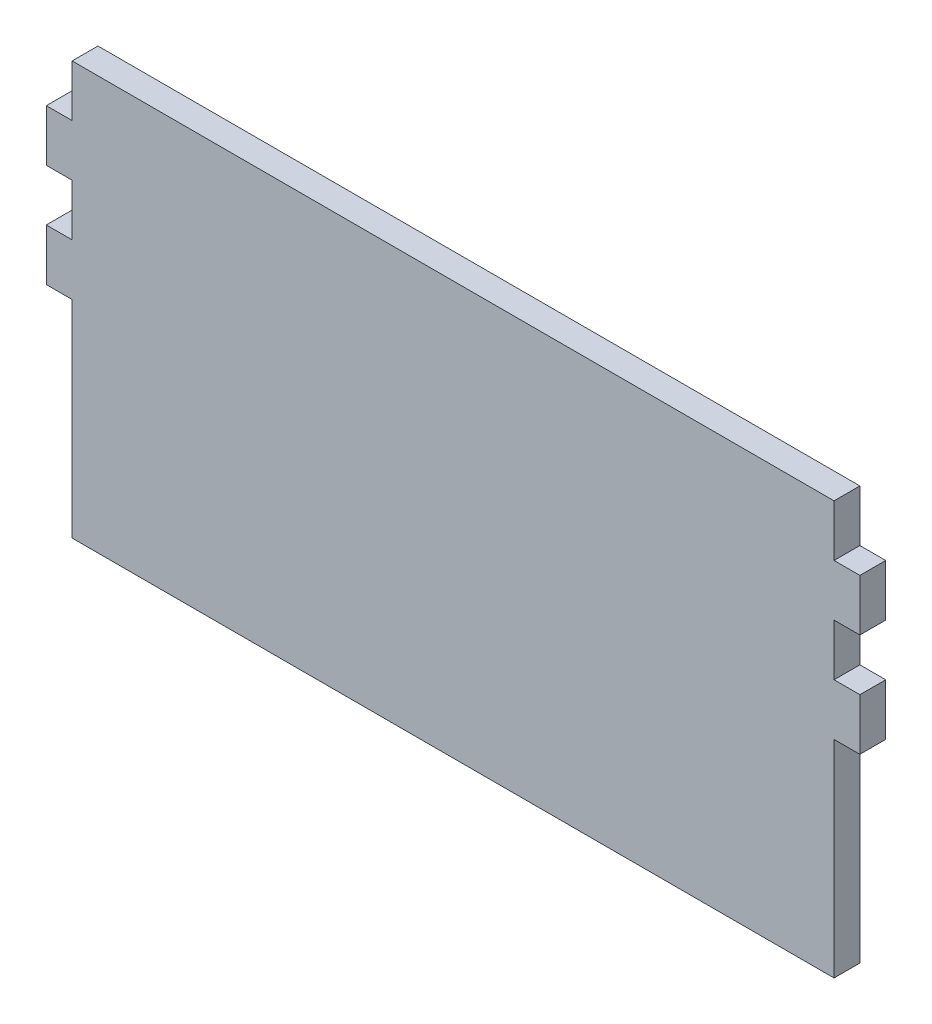
ISO-10303-21;
HEADER;
FILE_DESCRIPTION(('STEP AP214'),'2;1');
FILE_NAME('part.step','',(''),(''),'','','');
FILE_SCHEMA(('AUTOMOTIVE_DESIGN { 1 0 10303 214 1 1 1 1 }'));
ENDSEC;
DATA;
#1=APPLICATION_CONTEXT('core data for automotive mechanical design processes');
#2=APPLICATION_PROTOCOL_DEFINITION('international standard','automotive_design',2000,#1);
#3=PRODUCT_CONTEXT('',#1,'mechanical');
#4=PRODUCT('Part','Part','',(#3));
#5=PRODUCT_RELATED_PRODUCT_CATEGORY('part','',(#4));
#6=PRODUCT_DEFINITION_FORMATION('','',#4);
#7=PRODUCT_DEFINITION_CONTEXT('part definition',#1,'design');
#8=PRODUCT_DEFINITION('design','',#6,#7);
#9=PRODUCT_DEFINITION_SHAPE('','',#8);
#10=(LENGTH_UNIT() NAMED_UNIT(*) SI_UNIT(.MILLI.,.METRE.));
#11=(NAMED_UNIT(*) PLANE_ANGLE_UNIT() SI_UNIT($,.RADIAN.));
#12=(NAMED_UNIT(*) SI_UNIT($,.STERADIAN.) SOLID_ANGLE_UNIT());
#13=UNCERTAINTY_MEASURE_WITH_UNIT(LENGTH_MEASURE(1.E-05),#10,'distance_accuracy_value','');
#14=(GEOMETRIC_REPRESENTATION_CONTEXT(3) GLOBAL_UNCERTAINTY_ASSIGNED_CONTEXT((#13)) GLOBAL_UNIT_ASSIGNED_CONTEXT((#10,
#11,#12)) REPRESENTATION_CONTEXT('',''));
#15=CARTESIAN_POINT('',(0.,0.,0.));
#16=DIRECTION('',(0.,0.,1.));
#17=DIRECTION('',(1.,0.,0.));
#18=AXIS2_PLACEMENT_3D('',#15,#16,#17);
#19=CARTESIAN_POINT('',(93.6625,50.8,3.175));
#20=DIRECTION('',(-1.,0.,0.));
#21=DIRECTION('',(0.,0.,1.));
#22=AXIS2_PLACEMENT_3D('',#19,#20,#21);
#23=PLANE('',#22);
#24=DIRECTION('',(0.,1.,0.));
#25=VECTOR('',#24,1.);
#26=CARTESIAN_POINT('',(93.6625,50.8,-3.175));
#27=LINE('',#26,#25);
#28=CARTESIAN_POINT('',(93.6625,38.1,-3.175));
#29=VERTEX_POINT('',#28);
#30=CARTESIAN_POINT('',(93.6625,50.8,-3.175));
#31=VERTEX_POINT('',#30);
#32=EDGE_CURVE('E201',#29,#31,#27,.T.);
#33=ORIENTED_EDGE('',*,*,#32,.T.);
#34=DIRECTION('',(0.,0.,-1.));
#35=VECTOR('',#34,1.);
#36=CARTESIAN_POINT('',(93.6625,50.8,3.175));
#37=LINE('',#36,#35);
#38=CARTESIAN_POINT('',(93.6625,50.8,3.175));
#39=VERTEX_POINT('',#38);
#40=EDGE_CURVE('E11',#39,#31,#37,.T.);
#41=ORIENTED_EDGE('',*,*,#40,.F.);
#42=DIRECTION('',(0.,1.,0.));
#43=VECTOR('',#42,1.);
#44=CARTESIAN_POINT('',(93.6625,50.8,3.175));
#45=LINE('',#44,#43);
#46=CARTESIAN_POINT('',(93.6625,38.1,3.175));
#47=VERTEX_POINT('',#46);
#48=EDGE_CURVE('E239',#47,#39,#45,.T.);
#49=ORIENTED_EDGE('',*,*,#48,.F.);
#50=DIRECTION('',(0.,0.,-1.));
#51=VECTOR('',#50,1.);
#52=CARTESIAN_POINT('',(93.6625,38.1,3.175));
#53=LINE('',#52,#51);
#54=EDGE_CURVE('E197',#47,#29,#53,.T.);
#55=ORIENTED_EDGE('',*,*,#54,.T.);
#56=EDGE_LOOP('',(#33,#41,#49,#55));
#57=FACE_BOUND('',#56,.T.);
#58=ADVANCED_FACE('F33',(#57),#23,.F.);
#59=CARTESIAN_POINT('',(-93.6625,50.8,3.175));
#60=DIRECTION('',(0.,-1.,0.));
#61=DIRECTION('',(0.,0.,-1.));
#62=AXIS2_PLACEMENT_3D('',#59,#60,#61);
#63=PLANE('',#62);
#64=DIRECTION('',(-1.,0.,0.));
#65=VECTOR('',#64,1.);
#66=CARTESIAN_POINT('',(-93.6625,50.8,-3.175));
#67=LINE('',#66,#65);
#68=CARTESIAN_POINT('',(-93.6625,50.8,-3.175));
#69=VERTEX_POINT('',#68);
#70=EDGE_CURVE('E204',#31,#69,#67,.T.);
#71=ORIENTED_EDGE('',*,*,#70,.T.);
#72=DIRECTION('',(0.,0.,-1.));
#73=VECTOR('',#72,1.);
#74=CARTESIAN_POINT('',(-93.6625,50.8,3.175));
#75=LINE('',#74,#73);
#76=CARTESIAN_POINT('',(-93.6625,50.8,3.175));
#77=VERTEX_POINT('',#76);
#78=EDGE_CURVE('E41',#77,#69,#75,.T.);
#79=ORIENTED_EDGE('',*,*,#78,.F.);
#80=DIRECTION('',(-1.,0.,0.));
#81=VECTOR('',#80,1.);
#82=CARTESIAN_POINT('',(-93.6625,50.8,3.175));
#83=LINE('',#82,#81);
#84=EDGE_CURVE('E128',#39,#77,#83,.T.);
#85=ORIENTED_EDGE('',*,*,#84,.F.);
#86=ORIENTED_EDGE('',*,*,#40,.T.);
#87=EDGE_LOOP('',(#71,#79,#85,#86));
#88=FACE_BOUND('',#87,.T.);
#89=ADVANCED_FACE('F357',(#88),#63,.F.);
#90=CARTESIAN_POINT('',(-93.6625,50.8,3.175));
#91=DIRECTION('',(1.,0.,0.));
#92=DIRECTION('',(0.,0.,-1.));
#93=AXIS2_PLACEMENT_3D('',#90,#91,#92);
#94=PLANE('',#93);
#95=DIRECTION('',(0.,-1.,0.));
#96=VECTOR('',#95,1.);
#97=CARTESIAN_POINT('',(-93.6625,50.8,-3.175));
#98=LINE('',#97,#96);
#99=CARTESIAN_POINT('',(-93.6625,38.1,-3.175));
#100=VERTEX_POINT('',#99);
#101=EDGE_CURVE('E206',#69,#100,#98,.T.);
#102=ORIENTED_EDGE('',*,*,#101,.T.);
#103=DIRECTION('',(0.,0.,-1.));
#104=VECTOR('',#103,1.);
#105=CARTESIAN_POINT('',(-93.6625,38.1,3.175));
#106=LINE('',#105,#104);
#107=CARTESIAN_POINT('',(-93.6625,38.1,3.175));
#108=VERTEX_POINT('',#107);
#109=EDGE_CURVE('E282',#108,#100,#106,.T.);
#110=ORIENTED_EDGE('',*,*,#109,.F.);
#111=DIRECTION('',(0.,-1.,0.));
#112=VECTOR('',#111,1.);
#113=CARTESIAN_POINT('',(-93.6625,50.8,3.175));
#114=LINE('',#113,#112);
#115=EDGE_CURVE('E290',#77,#108,#114,.T.);
#116=ORIENTED_EDGE('',*,*,#115,.F.);
#117=ORIENTED_EDGE('',*,*,#78,.T.);
#118=EDGE_LOOP('',(#102,#110,#116,#117));
#119=FACE_BOUND('',#118,.T.);
#120=ADVANCED_FACE('F288',(#119),#94,.F.);
#121=CARTESIAN_POINT('',(-93.6625,38.1,3.175));
#122=DIRECTION('',(0.,-1.,0.));
#123=DIRECTION('',(0.,0.,-1.));
#124=AXIS2_PLACEMENT_3D('',#121,#122,#123);
#125=PLANE('',#124);
#126=DIRECTION('',(-1.,0.,0.));
#127=VECTOR('',#126,1.);
#128=CARTESIAN_POINT('',(-93.6625,38.1,-3.175));
#129=LINE('',#128,#127);
#130=CARTESIAN_POINT('',(-100.0125,38.1,-3.175));
#131=VERTEX_POINT('',#130);
#132=EDGE_CURVE('E208',#100,#131,#129,.T.);
#133=ORIENTED_EDGE('',*,*,#132,.T.);
#134=DIRECTION('',(0.,0.,-1.));
#135=VECTOR('',#134,1.);
#136=CARTESIAN_POINT('',(-100.0125,38.1,3.175));
#137=LINE('',#136,#135);
#138=CARTESIAN_POINT('',(-100.0125,38.1,3.175));
#139=VERTEX_POINT('',#138);
#140=EDGE_CURVE('E279',#139,#131,#137,.T.);
#141=ORIENTED_EDGE('',*,*,#140,.F.);
#142=DIRECTION('',(-1.,0.,0.));
#143=VECTOR('',#142,1.);
#144=CARTESIAN_POINT('',(-93.6625,38.1,3.175));
#145=LINE('',#144,#143);
#146=EDGE_CURVE('E308',#108,#139,#145,.T.);
#147=ORIENTED_EDGE('',*,*,#146,.F.);
#148=ORIENTED_EDGE('',*,*,#109,.T.);
#149=EDGE_LOOP('',(#133,#141,#147,#148));
#150=FACE_BOUND('',#149,.T.);
#151=ADVANCED_FACE('F299',(#150),#125,.F.);
#152=CARTESIAN_POINT('',(-100.0125,38.1,3.175));
#153=DIRECTION('',(1.,0.,0.));
#154=DIRECTION('',(0.,0.,-1.));
#155=AXIS2_PLACEMENT_3D('',#152,#153,#154);
#156=PLANE('',#155);
#157=DIRECTION('',(0.,-1.,0.));
#158=VECTOR('',#157,1.);
#159=CARTESIAN_POINT('',(-100.0125,38.1,-3.175));
#160=LINE('',#159,#158);
#161=CARTESIAN_POINT('',(-100.0125,25.4,-3.175));
#162=VERTEX_POINT('',#161);
#163=EDGE_CURVE('E210',#131,#162,#160,.T.);
#164=ORIENTED_EDGE('',*,*,#163,.T.);
#165=DIRECTION('',(0.,0.,-1.));
#166=VECTOR('',#165,1.);
#167=CARTESIAN_POINT('',(-100.0125,25.4,3.175));
#168=LINE('',#167,#166);
#169=CARTESIAN_POINT('',(-100.0125,25.4,3.175));
#170=VERTEX_POINT('',#169);
#171=EDGE_CURVE('E276',#170,#162,#168,.T.);
#172=ORIENTED_EDGE('',*,*,#171,.F.);
#173=DIRECTION('',(0.,-1.,0.));
#174=VECTOR('',#173,1.);
#175=CARTESIAN_POINT('',(-100.0125,38.1,3.175));
#176=LINE('',#175,#174);
#177=EDGE_CURVE('E305',#139,#170,#176,.T.);
#178=ORIENTED_EDGE('',*,*,#177,.F.);
#179=ORIENTED_EDGE('',*,*,#140,.T.);
#180=EDGE_LOOP('',(#164,#172,#178,#179));
#181=FACE_BOUND('',#180,.T.);
#182=ADVANCED_FACE('F303',(#181),#156,.F.);
#183=CARTESIAN_POINT('',(-100.0125,25.4,3.175));
#184=DIRECTION('',(0.,1.,0.));
#185=DIRECTION('',(0.,0.,1.));
#186=AXIS2_PLACEMENT_3D('',#183,#184,#185);
#187=PLANE('',#186);
#188=DIRECTION('',(1.,0.,0.));
#189=VECTOR('',#188,1.);
#190=CARTESIAN_POINT('',(-100.0125,25.4,-3.175));
#191=LINE('',#190,#189);
#192=CARTESIAN_POINT('',(-93.6625,25.4,-3.175));
#193=VERTEX_POINT('',#192);
#194=EDGE_CURVE('E212',#162,#193,#191,.T.);
#195=ORIENTED_EDGE('',*,*,#194,.T.);
#196=DIRECTION('',(0.,0.,-1.));
#197=VECTOR('',#196,1.);
#198=CARTESIAN_POINT('',(-93.6625,25.4,3.175));
#199=LINE('',#198,#197);
#200=CARTESIAN_POINT('',(-93.6625,25.4,3.175));
#201=VERTEX_POINT('',#200);
#202=EDGE_CURVE('E273',#201,#193,#199,.T.);
#203=ORIENTED_EDGE('',*,*,#202,.F.);
#204=DIRECTION('',(1.,0.,0.));
#205=VECTOR('',#204,1.);
#206=CARTESIAN_POINT('',(-100.0125,25.4,3.175));
#207=LINE('',#206,#205);
#208=EDGE_CURVE('E307',#170,#201,#207,.T.);
#209=ORIENTED_EDGE('',*,*,#208,.F.);
#210=ORIENTED_EDGE('',*,*,#171,.T.);
#211=EDGE_LOOP('',(#195,#203,#209,#210));
#212=FACE_BOUND('',#211,.T.);
#213=ADVANCED_FACE('F370',(#212),#187,.F.);
#214=CARTESIAN_POINT('',(-93.6625,25.4,3.175));
#215=DIRECTION('',(1.,0.,0.));
#216=DIRECTION('',(0.,0.,-1.));
#217=AXIS2_PLACEMENT_3D('',#214,#215,#216);
#218=PLANE('',#217);
#219=DIRECTION('',(0.,-1.,0.));
#220=VECTOR('',#219,1.);
#221=CARTESIAN_POINT('',(-93.6625,25.4,-3.175));
#222=LINE('',#221,#220);
#223=CARTESIAN_POINT('',(-93.6625,12.7000000000001,-3.175));
#224=VERTEX_POINT('',#223);
#225=EDGE_CURVE('E214',#193,#224,#222,.T.);
#226=ORIENTED_EDGE('',*,*,#225,.T.);
#227=DIRECTION('',(0.,0.,-1.));
#228=VECTOR('',#227,1.);
#229=CARTESIAN_POINT('',(-93.6625,12.7000000000001,3.175));
#230=LINE('',#229,#228);
#231=CARTESIAN_POINT('',(-93.6625,12.7000000000001,3.175));
#232=VERTEX_POINT('',#231);
#233=EDGE_CURVE('E270',#232,#224,#230,.T.);
#234=ORIENTED_EDGE('',*,*,#233,.F.);
#235=DIRECTION('',(0.,-1.,0.));
#236=VECTOR('',#235,1.);
#237=CARTESIAN_POINT('',(-93.6625,25.4,3.175));
#238=LINE('',#237,#236);
#239=EDGE_CURVE('E310',#201,#232,#238,.T.);
#240=ORIENTED_EDGE('',*,*,#239,.F.);
#241=ORIENTED_EDGE('',*,*,#202,.T.);
#242=EDGE_LOOP('',(#226,#234,#240,#241));
#243=FACE_BOUND('',#242,.T.);
#244=ADVANCED_FACE('F373',(#243),#218,.F.);
#245=CARTESIAN_POINT('',(-93.6625,12.7000000000001,3.175));
#246=DIRECTION('',(0.,-1.,0.));
#247=DIRECTION('',(1.,0.,0.));
#248=AXIS2_PLACEMENT_3D('',#245,#246,#247);
#249=PLANE('',#248);
#250=DIRECTION('',(-1.,0.,0.));
#251=VECTOR('',#250,1.);
#252=CARTESIAN_POINT('',(-93.6625,12.7000000000001,-3.175));
#253=LINE('',#252,#251);
#254=CARTESIAN_POINT('',(-100.0125,12.7000000000001,-3.175));
#255=VERTEX_POINT('',#254);
#256=EDGE_CURVE('E216',#224,#255,#253,.T.);
#257=ORIENTED_EDGE('',*,*,#256,.T.);
#258=DIRECTION('',(0.,0.,-1.));
#259=VECTOR('',#258,1.);
#260=CARTESIAN_POINT('',(-100.0125,12.7000000000001,3.175));
#261=LINE('',#260,#259);
#262=CARTESIAN_POINT('',(-100.0125,12.7000000000001,3.175));
#263=VERTEX_POINT('',#262);
#264=EDGE_CURVE('E267',#263,#255,#261,.T.);
#265=ORIENTED_EDGE('',*,*,#264,.F.);
#266=DIRECTION('',(-1.,0.,0.));
#267=VECTOR('',#266,1.);
#268=CARTESIAN_POINT('',(-93.6625,12.7000000000001,3.175));
#269=LINE('',#268,#267);
#270=EDGE_CURVE('E316',#232,#263,#269,.T.);
#271=ORIENTED_EDGE('',*,*,#270,.F.);
#272=ORIENTED_EDGE('',*,*,#233,.T.);
#273=EDGE_LOOP('',(#257,#265,#271,#272));
#274=FACE_BOUND('',#273,.T.);
#275=ADVANCED_FACE('F377',(#274),#249,.F.);
#276=CARTESIAN_POINT('',(-100.0125,12.7000000000001,3.175));
#277=DIRECTION('',(1.,0.,0.));
#278=DIRECTION('',(0.,0.,-1.));
#279=AXIS2_PLACEMENT_3D('',#276,#277,#278);
#280=PLANE('',#279);
#281=DIRECTION('',(0.,-1.,0.));
#282=VECTOR('',#281,1.);
#283=CARTESIAN_POINT('',(-100.0125,12.7000000000001,-3.175));
#284=LINE('',#283,#282);
#285=CARTESIAN_POINT('',(-100.0125,0.,-3.175));
#286=VERTEX_POINT('',#285);
#287=EDGE_CURVE('E218',#255,#286,#284,.T.);
#288=ORIENTED_EDGE('',*,*,#287,.T.);
#289=DIRECTION('',(0.,0.,-1.));
#290=VECTOR('',#289,1.);
#291=CARTESIAN_POINT('',(-100.0125,0.,3.175));
#292=LINE('',#291,#290);
#293=CARTESIAN_POINT('',(-100.0125,0.,3.175));
#294=VERTEX_POINT('',#293);
#295=EDGE_CURVE('E264',#294,#286,#292,.T.);
#296=ORIENTED_EDGE('',*,*,#295,.F.);
#297=DIRECTION('',(0.,-1.,0.));
#298=VECTOR('',#297,1.);
#299=CARTESIAN_POINT('',(-100.0125,12.7000000000001,3.175));
#300=LINE('',#299,#298);
#301=EDGE_CURVE('E318',#263,#294,#300,.T.);
#302=ORIENTED_EDGE('',*,*,#301,.F.);
#303=ORIENTED_EDGE('',*,*,#264,.T.);
#304=EDGE_LOOP('',(#288,#296,#302,#303));
#305=FACE_BOUND('',#304,.T.);
#306=ADVANCED_FACE('F381',(#305),#280,.F.);
#307=CARTESIAN_POINT('',(-100.0125,0.,3.175));
#308=DIRECTION('',(0.,1.,0.));
#309=DIRECTION('',(-1.,0.,0.));
#310=AXIS2_PLACEMENT_3D('',#307,#308,#309);
#311=PLANE('',#310);
#312=DIRECTION('',(1.,0.,0.));
#313=VECTOR('',#312,1.);
#314=CARTESIAN_POINT('',(-100.0125,0.,-3.175));
#315=LINE('',#314,#313);
#316=CARTESIAN_POINT('',(-93.6625,0.,-3.175));
#317=VERTEX_POINT('',#316);
#318=EDGE_CURVE('E220',#286,#317,#315,.T.);
#319=ORIENTED_EDGE('',*,*,#318,.T.);
#320=DIRECTION('',(0.,0.,-1.));
#321=VECTOR('',#320,1.);
#322=CARTESIAN_POINT('',(-93.6625,0.,3.175));
#323=LINE('',#322,#321);
#324=CARTESIAN_POINT('',(-93.6625,0.,3.175));
#325=VERTEX_POINT('',#324);
#326=EDGE_CURVE('E261',#325,#317,#323,.T.);
#327=ORIENTED_EDGE('',*,*,#326,.F.);
#328=DIRECTION('',(1.,0.,0.));
#329=VECTOR('',#328,1.);
#330=CARTESIAN_POINT('',(-100.0125,0.,3.175));
#331=LINE('',#330,#329);
#332=EDGE_CURVE('E320',#294,#325,#331,.T.);
#333=ORIENTED_EDGE('',*,*,#332,.F.);
#334=ORIENTED_EDGE('',*,*,#295,.T.);
#335=EDGE_LOOP('',(#319,#327,#333,#334));
#336=FACE_BOUND('',#335,.T.);
#337=ADVANCED_FACE('F385',(#336),#311,.F.);
#338=CARTESIAN_POINT('',(-93.6625,0.,3.175));
#339=DIRECTION('',(1.,0.,0.));
#340=DIRECTION('',(0.,0.,-1.));
#341=AXIS2_PLACEMENT_3D('',#338,#339,#340);
#342=PLANE('',#341);
#343=DIRECTION('',(0.,-1.,0.));
#344=VECTOR('',#343,1.);
#345=CARTESIAN_POINT('',(-93.6625,0.,-3.175));
#346=LINE('',#345,#344);
#347=CARTESIAN_POINT('',(-93.6625,-50.8,-3.175));
#348=VERTEX_POINT('',#347);
#349=EDGE_CURVE('E222',#317,#348,#346,.T.);
#350=ORIENTED_EDGE('',*,*,#349,.T.);
#351=DIRECTION('',(0.,0.,-1.));
#352=VECTOR('',#351,1.);
#353=CARTESIAN_POINT('',(-93.6625,-50.8,3.175));
#354=LINE('',#353,#352);
#355=CARTESIAN_POINT('',(-93.6625,-50.8,3.175));
#356=VERTEX_POINT('',#355);
#357=EDGE_CURVE('E258',#356,#348,#354,.T.);
#358=ORIENTED_EDGE('',*,*,#357,.F.);
#359=DIRECTION('',(0.,-1.,0.));
#360=VECTOR('',#359,1.);
#361=CARTESIAN_POINT('',(-93.6625,0.,3.175));
#362=LINE('',#361,#360);
#363=EDGE_CURVE('E322',#325,#356,#362,.T.);
#364=ORIENTED_EDGE('',*,*,#363,.F.);
#365=ORIENTED_EDGE('',*,*,#326,.T.);
#366=EDGE_LOOP('',(#350,#358,#364,#365));
#367=FACE_BOUND('',#366,.T.);
#368=ADVANCED_FACE('F389',(#367),#342,.F.);
#369=CARTESIAN_POINT('',(-93.6625,-50.8,3.175));
#370=DIRECTION('',(0.,1.,0.));
#371=DIRECTION('',(0.,0.,1.));
#372=AXIS2_PLACEMENT_3D('',#369,#370,#371);
#373=PLANE('',#372);
#374=DIRECTION('',(1.,0.,0.));
#375=VECTOR('',#374,1.);
#376=CARTESIAN_POINT('',(-93.6625,-50.8,-3.175));
#377=LINE('',#376,#375);
#378=CARTESIAN_POINT('',(93.6625,-50.8,-3.175));
#379=VERTEX_POINT('',#378);
#380=EDGE_CURVE('E224',#348,#379,#377,.T.);
#381=ORIENTED_EDGE('',*,*,#380,.T.);
#382=DIRECTION('',(0.,0.,-1.));
#383=VECTOR('',#382,1.);
#384=CARTESIAN_POINT('',(93.6625,-50.8,3.175));
#385=LINE('',#384,#383);
#386=CARTESIAN_POINT('',(93.6625,-50.8,3.175));
#387=VERTEX_POINT('',#386);
#388=EDGE_CURVE('E255',#387,#379,#385,.T.);
#389=ORIENTED_EDGE('',*,*,#388,.F.);
#390=DIRECTION('',(1.,0.,0.));
#391=VECTOR('',#390,1.);
#392=CARTESIAN_POINT('',(-93.6625,-50.8,3.175));
#393=LINE('',#392,#391);
#394=EDGE_CURVE('E324',#356,#387,#393,.T.);
#395=ORIENTED_EDGE('',*,*,#394,.F.);
#396=ORIENTED_EDGE('',*,*,#357,.T.);
#397=EDGE_LOOP('',(#381,#389,#395,#396));
#398=FACE_BOUND('',#397,.T.);
#399=ADVANCED_FACE('F393',(#398),#373,.F.);
#400=CARTESIAN_POINT('',(93.6625,0.,3.175));
#401=DIRECTION('',(-1.,0.,0.));
#402=DIRECTION('',(0.,0.,1.));
#403=AXIS2_PLACEMENT_3D('',#400,#401,#402);
#404=PLANE('',#403);
#405=DIRECTION('',(0.,1.,0.));
#406=VECTOR('',#405,1.);
#407=CARTESIAN_POINT('',(93.6625,0.,-3.175));
#408=LINE('',#407,#406);
#409=CARTESIAN_POINT('',(93.6625,0.,-3.175));
#410=VERTEX_POINT('',#409);
#411=EDGE_CURVE('E226',#379,#410,#408,.T.);
#412=ORIENTED_EDGE('',*,*,#411,.T.);
#413=DIRECTION('',(0.,0.,-1.));
#414=VECTOR('',#413,1.);
#415=CARTESIAN_POINT('',(93.6625,0.,3.175));
#416=LINE('',#415,#414);
#417=CARTESIAN_POINT('',(93.6625,0.,3.175));
#418=VERTEX_POINT('',#417);
#419=EDGE_CURVE('E252',#418,#410,#416,.T.);
#420=ORIENTED_EDGE('',*,*,#419,.F.);
#421=DIRECTION('',(0.,1.,0.));
#422=VECTOR('',#421,1.);
#423=CARTESIAN_POINT('',(93.6625,0.,3.175));
#424=LINE('',#423,#422);
#425=EDGE_CURVE('E326',#387,#418,#424,.T.);
#426=ORIENTED_EDGE('',*,*,#425,.F.);
#427=ORIENTED_EDGE('',*,*,#388,.T.);
#428=EDGE_LOOP('',(#412,#420,#426,#427));
#429=FACE_BOUND('',#428,.T.);
#430=ADVANCED_FACE('F397',(#429),#404,.F.);
#431=CARTESIAN_POINT('',(100.0125,0.,3.175));
#432=DIRECTION('',(0.,1.,0.));
#433=DIRECTION('',(-1.,0.,0.));
#434=AXIS2_PLACEMENT_3D('',#431,#432,#433);
#435=PLANE('',#434);
#436=DIRECTION('',(1.,0.,0.));
#437=VECTOR('',#436,1.);
#438=CARTESIAN_POINT('',(100.0125,0.,-3.175));
#439=LINE('',#438,#437);
#440=CARTESIAN_POINT('',(100.0125,0.,-3.175));
#441=VERTEX_POINT('',#440);
#442=EDGE_CURVE('E228',#410,#441,#439,.T.);
#443=ORIENTED_EDGE('',*,*,#442,.T.);
#444=DIRECTION('',(0.,0.,-1.));
#445=VECTOR('',#444,1.);
#446=CARTESIAN_POINT('',(100.0125,0.,3.175));
#447=LINE('',#446,#445);
#448=CARTESIAN_POINT('',(100.0125,0.,3.175));
#449=VERTEX_POINT('',#448);
#450=EDGE_CURVE('E249',#449,#441,#447,.T.);
#451=ORIENTED_EDGE('',*,*,#450,.F.);
#452=DIRECTION('',(1.,0.,0.));
#453=VECTOR('',#452,1.);
#454=CARTESIAN_POINT('',(100.0125,0.,3.175));
#455=LINE('',#454,#453);
#456=EDGE_CURVE('E328',#418,#449,#455,.T.);
#457=ORIENTED_EDGE('',*,*,#456,.F.);
#458=ORIENTED_EDGE('',*,*,#419,.T.);
#459=EDGE_LOOP('',(#443,#451,#457,#458));
#460=FACE_BOUND('',#459,.T.);
#461=ADVANCED_FACE('F401',(#460),#435,.F.);
#462=CARTESIAN_POINT('',(100.0125,12.7000000000001,3.175));
#463=DIRECTION('',(-1.,0.,0.));
#464=DIRECTION('',(0.,0.,1.));
#465=AXIS2_PLACEMENT_3D('',#462,#463,#464);
#466=PLANE('',#465);
#467=DIRECTION('',(0.,1.,0.));
#468=VECTOR('',#467,1.);
#469=CARTESIAN_POINT('',(100.0125,12.7000000000001,-3.175));
#470=LINE('',#469,#468);
#471=CARTESIAN_POINT('',(100.0125,12.7000000000001,-3.175));
#472=VERTEX_POINT('',#471);
#473=EDGE_CURVE('E230',#441,#472,#470,.T.);
#474=ORIENTED_EDGE('',*,*,#473,.T.);
#475=DIRECTION('',(0.,0.,-1.));
#476=VECTOR('',#475,1.);
#477=CARTESIAN_POINT('',(100.0125,12.7000000000001,3.175));
#478=LINE('',#477,#476);
#479=CARTESIAN_POINT('',(100.0125,12.7000000000001,3.175));
#480=VERTEX_POINT('',#479);
#481=EDGE_CURVE('E246',#480,#472,#478,.T.);
#482=ORIENTED_EDGE('',*,*,#481,.F.);
#483=DIRECTION('',(0.,1.,0.));
#484=VECTOR('',#483,1.);
#485=CARTESIAN_POINT('',(100.0125,12.7000000000001,3.175));
#486=LINE('',#485,#484);
#487=EDGE_CURVE('E330',#449,#480,#486,.T.);
#488=ORIENTED_EDGE('',*,*,#487,.F.);
#489=ORIENTED_EDGE('',*,*,#450,.T.);
#490=EDGE_LOOP('',(#474,#482,#488,#489));
#491=FACE_BOUND('',#490,.T.);
#492=ADVANCED_FACE('F405',(#491),#466,.F.);
#493=CARTESIAN_POINT('',(93.6625,12.7000000000001,3.175));
#494=DIRECTION('',(0.,-1.,0.));
#495=DIRECTION('',(0.,0.,-1.));
#496=AXIS2_PLACEMENT_3D('',#493,#494,#495);
#497=PLANE('',#496);
#498=DIRECTION('',(-1.,0.,0.));
#499=VECTOR('',#498,1.);
#500=CARTESIAN_POINT('',(93.6625,12.7000000000001,-3.175));
#501=LINE('',#500,#499);
#502=CARTESIAN_POINT('',(93.6625,12.7000000000001,-3.175));
#503=VERTEX_POINT('',#502);
#504=EDGE_CURVE('E232',#472,#503,#501,.T.);
#505=ORIENTED_EDGE('',*,*,#504,.T.);
#506=DIRECTION('',(0.,0.,-1.));
#507=VECTOR('',#506,1.);
#508=CARTESIAN_POINT('',(93.6625,12.7000000000001,3.175));
#509=LINE('',#508,#507);
#510=CARTESIAN_POINT('',(93.6625,12.7000000000001,3.175));
#511=VERTEX_POINT('',#510);
#512=EDGE_CURVE('E243',#511,#503,#509,.T.);
#513=ORIENTED_EDGE('',*,*,#512,.F.);
#514=DIRECTION('',(-1.,0.,0.));
#515=VECTOR('',#514,1.);
#516=CARTESIAN_POINT('',(93.6625,12.7000000000001,3.175));
#517=LINE('',#516,#515);
#518=EDGE_CURVE('E332',#480,#511,#517,.T.);
#519=ORIENTED_EDGE('',*,*,#518,.F.);
#520=ORIENTED_EDGE('',*,*,#481,.T.);
#521=EDGE_LOOP('',(#505,#513,#519,#520));
#522=FACE_BOUND('',#521,.T.);
#523=ADVANCED_FACE('F338',(#522),#497,.F.);
#524=CARTESIAN_POINT('',(93.6625,25.4,3.175));
#525=DIRECTION('',(-1.,0.,0.));
#526=DIRECTION('',(0.,0.,1.));
#527=AXIS2_PLACEMENT_3D('',#524,#525,#526);
#528=PLANE('',#527);
#529=DIRECTION('',(0.,1.,0.));
#530=VECTOR('',#529,1.);
#531=CARTESIAN_POINT('',(93.6625,25.4,-3.175));
#532=LINE('',#531,#530);
#533=CARTESIAN_POINT('',(93.6625,25.4,-3.175));
#534=VERTEX_POINT('',#533);
#535=EDGE_CURVE('E234',#503,#534,#532,.T.);
#536=ORIENTED_EDGE('',*,*,#535,.T.);
#537=DIRECTION('',(0.,0.,-1.));
#538=VECTOR('',#537,1.);
#539=CARTESIAN_POINT('',(93.6625,25.4,3.175));
#540=LINE('',#539,#538);
#541=CARTESIAN_POINT('',(93.6625,25.4,3.175));
#542=VERTEX_POINT('',#541);
#543=EDGE_CURVE('E192',#542,#534,#540,.T.);
#544=ORIENTED_EDGE('',*,*,#543,.F.);
#545=DIRECTION('',(0.,1.,0.));
#546=VECTOR('',#545,1.);
#547=CARTESIAN_POINT('',(93.6625,25.4,3.175));
#548=LINE('',#547,#546);
#549=EDGE_CURVE('E183',#511,#542,#548,.T.);
#550=ORIENTED_EDGE('',*,*,#549,.F.);
#551=ORIENTED_EDGE('',*,*,#512,.T.);
#552=EDGE_LOOP('',(#536,#544,#550,#551));
#553=FACE_BOUND('',#552,.T.);
#554=ADVANCED_FACE('F342',(#553),#528,.F.);
#555=CARTESIAN_POINT('',(100.0125,25.4,3.175));
#556=DIRECTION('',(0.,1.,0.));
#557=DIRECTION('',(0.,0.,1.));
#558=AXIS2_PLACEMENT_3D('',#555,#556,#557);
#559=PLANE('',#558);
#560=DIRECTION('',(1.,0.,0.));
#561=VECTOR('',#560,1.);
#562=CARTESIAN_POINT('',(100.0125,25.4,-3.175));
#563=LINE('',#562,#561);
#564=CARTESIAN_POINT('',(100.0125,25.4,-3.175));
#565=VERTEX_POINT('',#564);
#566=EDGE_CURVE('E191',#534,#565,#563,.T.);
#567=ORIENTED_EDGE('',*,*,#566,.T.);
#568=DIRECTION('',(0.,0.,-1.));
#569=VECTOR('',#568,1.);
#570=CARTESIAN_POINT('',(100.0125,25.4,3.175));
#571=LINE('',#570,#569);
#572=CARTESIAN_POINT('',(100.0125,25.4,3.175));
#573=VERTEX_POINT('',#572);
#574=EDGE_CURVE('E188',#573,#565,#571,.T.);
#575=ORIENTED_EDGE('',*,*,#574,.F.);
#576=DIRECTION('',(1.,0.,0.));
#577=VECTOR('',#576,1.);
#578=CARTESIAN_POINT('',(100.0125,25.4,3.175));
#579=LINE('',#578,#577);
#580=EDGE_CURVE('E177',#542,#573,#579,.T.);
#581=ORIENTED_EDGE('',*,*,#580,.F.);
#582=ORIENTED_EDGE('',*,*,#543,.T.);
#583=EDGE_LOOP('',(#567,#575,#581,#582));
#584=FACE_BOUND('',#583,.T.);
#585=ADVANCED_FACE('F189',(#584),#559,.F.);
#586=CARTESIAN_POINT('',(100.0125,38.1,3.175));
#587=DIRECTION('',(-1.,0.,0.));
#588=DIRECTION('',(0.,0.,1.));
#589=AXIS2_PLACEMENT_3D('',#586,#587,#588);
#590=PLANE('',#589);
#591=DIRECTION('',(0.,1.,0.));
#592=VECTOR('',#591,1.);
#593=CARTESIAN_POINT('',(100.0125,38.1,-3.175));
#594=LINE('',#593,#592);
#595=CARTESIAN_POINT('',(100.0125,38.1,-3.175));
#596=VERTEX_POINT('',#595);
#597=EDGE_CURVE('E114',#565,#596,#594,.T.);
#598=ORIENTED_EDGE('',*,*,#597,.T.);
#599=DIRECTION('',(0.,0.,-1.));
#600=VECTOR('',#599,1.);
#601=CARTESIAN_POINT('',(100.0125,38.1,3.175));
#602=LINE('',#601,#600);
#603=CARTESIAN_POINT('',(100.0125,38.1,3.175));
#604=VERTEX_POINT('',#603);
#605=EDGE_CURVE('E193',#604,#596,#602,.T.);
#606=ORIENTED_EDGE('',*,*,#605,.F.);
#607=DIRECTION('',(0.,1.,0.));
#608=VECTOR('',#607,1.);
#609=CARTESIAN_POINT('',(100.0125,38.1,3.175));
#610=LINE('',#609,#608);
#611=EDGE_CURVE('E181',#573,#604,#610,.T.);
#612=ORIENTED_EDGE('',*,*,#611,.F.);
#613=ORIENTED_EDGE('',*,*,#574,.T.);
#614=EDGE_LOOP('',(#598,#606,#612,#613));
#615=FACE_BOUND('',#614,.T.);
#616=ADVANCED_FACE('F195',(#615),#590,.F.);
#617=CARTESIAN_POINT('',(93.6625,38.1,3.175));
#618=DIRECTION('',(0.,-1.,0.));
#619=DIRECTION('',(0.,0.,-1.));
#620=AXIS2_PLACEMENT_3D('',#617,#618,#619);
#621=PLANE('',#620);
#622=DIRECTION('',(-1.,0.,0.));
#623=VECTOR('',#622,1.);
#624=CARTESIAN_POINT('',(93.6625,38.1,-3.175));
#625=LINE('',#624,#623);
#626=EDGE_CURVE('E120',#596,#29,#625,.T.);
#627=ORIENTED_EDGE('',*,*,#626,.T.);
#628=ORIENTED_EDGE('',*,*,#54,.F.);
#629=DIRECTION('',(-1.,0.,0.));
#630=VECTOR('',#629,1.);
#631=CARTESIAN_POINT('',(93.6625,38.1,3.175));
#632=LINE('',#631,#630);
#633=EDGE_CURVE('E49',#604,#47,#632,.T.);
#634=ORIENTED_EDGE('',*,*,#633,.F.);
#635=ORIENTED_EDGE('',*,*,#605,.T.);
#636=EDGE_LOOP('',(#627,#628,#634,#635));
#637=FACE_BOUND('',#636,.T.);
#638=ADVANCED_FACE('F346',(#637),#621,.F.);
#639=CARTESIAN_POINT('',(0.,0.,3.175));
#640=DIRECTION('',(0.,0.,1.));
#641=DIRECTION('',(1.,0.,0.));
#642=AXIS2_PLACEMENT_3D('',#639,#640,#641);
#643=PLANE('',#642);
#644=ORIENTED_EDGE('',*,*,#48,.T.);
#645=ORIENTED_EDGE('',*,*,#84,.T.);
#646=ORIENTED_EDGE('',*,*,#115,.T.);
#647=ORIENTED_EDGE('',*,*,#146,.T.);
#648=ORIENTED_EDGE('',*,*,#177,.T.);
#649=ORIENTED_EDGE('',*,*,#208,.T.);
#650=ORIENTED_EDGE('',*,*,#239,.T.);
#651=ORIENTED_EDGE('',*,*,#270,.T.);
#652=ORIENTED_EDGE('',*,*,#301,.T.);
#653=ORIENTED_EDGE('',*,*,#332,.T.);
#654=ORIENTED_EDGE('',*,*,#363,.T.);
#655=ORIENTED_EDGE('',*,*,#394,.T.);
#656=ORIENTED_EDGE('',*,*,#425,.T.);
#657=ORIENTED_EDGE('',*,*,#456,.T.);
#658=ORIENTED_EDGE('',*,*,#487,.T.);
#659=ORIENTED_EDGE('',*,*,#518,.T.);
#660=ORIENTED_EDGE('',*,*,#549,.T.);
#661=ORIENTED_EDGE('',*,*,#580,.T.);
#662=ORIENTED_EDGE('',*,*,#611,.T.);
#663=ORIENTED_EDGE('',*,*,#633,.T.);
#664=EDGE_LOOP('',(#644,#645,#646,#647,#648,#649,#650,#651,#652,#653,#654,#655,#656,#657,#658,
#659,#660,#661,#662,#663));
#665=FACE_BOUND('',#664,.T.);
#666=ADVANCED_FACE('F179',(#665),#643,.T.);
#667=CARTESIAN_POINT('',(0.,0.,-3.175));
#668=DIRECTION('',(0.,0.,1.));
#669=DIRECTION('',(1.,0.,0.));
#670=AXIS2_PLACEMENT_3D('',#667,#668,#669);
#671=PLANE('',#670);
#672=ORIENTED_EDGE('',*,*,#32,.F.);
#673=ORIENTED_EDGE('',*,*,#626,.F.);
#674=ORIENTED_EDGE('',*,*,#597,.F.);
#675=ORIENTED_EDGE('',*,*,#566,.F.);
#676=ORIENTED_EDGE('',*,*,#535,.F.);
#677=ORIENTED_EDGE('',*,*,#504,.F.);
#678=ORIENTED_EDGE('',*,*,#473,.F.);
#679=ORIENTED_EDGE('',*,*,#442,.F.);
#680=ORIENTED_EDGE('',*,*,#411,.F.);
#681=ORIENTED_EDGE('',*,*,#380,.F.);
#682=ORIENTED_EDGE('',*,*,#349,.F.);
#683=ORIENTED_EDGE('',*,*,#318,.F.);
#684=ORIENTED_EDGE('',*,*,#287,.F.);
#685=ORIENTED_EDGE('',*,*,#256,.F.);
#686=ORIENTED_EDGE('',*,*,#225,.F.);
#687=ORIENTED_EDGE('',*,*,#194,.F.);
#688=ORIENTED_EDGE('',*,*,#163,.F.);
#689=ORIENTED_EDGE('',*,*,#132,.F.);
#690=ORIENTED_EDGE('',*,*,#101,.F.);
#691=ORIENTED_EDGE('',*,*,#70,.F.);
#692=EDGE_LOOP('',(#672,#673,#674,#675,#676,#677,#678,#679,#680,#681,#682,#683,#684,#685,#686,
#687,#688,#689,#690,#691));
#693=FACE_BOUND('',#692,.T.);
#694=ADVANCED_FACE('F294',(#693),#671,.F.);
#695=CLOSED_SHELL('',(#58,#89,#120,#151,#182,#213,#244,#275,#306,#337,#368,#399,#430,#461,#492,
#523,#554,#585,#616,#638,#666,#694));
#696=MANIFOLD_SOLID_BREP('B2',#695);
#697=ADVANCED_BREP_SHAPE_REPRESENTATION('',(#18,#696),#14);
#698=SHAPE_DEFINITION_REPRESENTATION(#9,#697);
ENDSEC;
END-ISO-10303-21;
